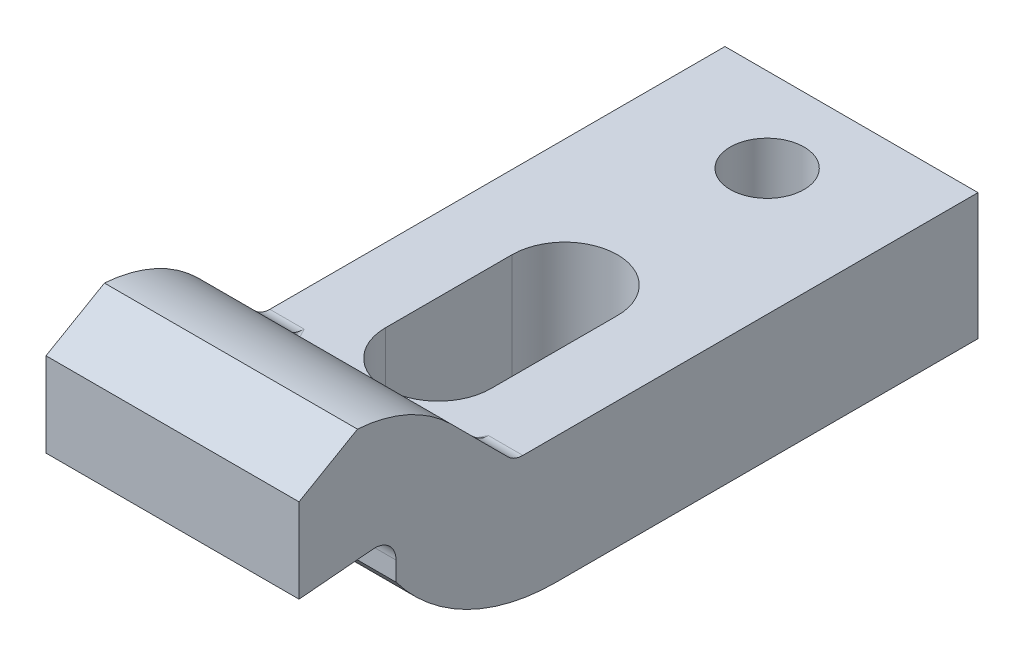
ISO-10303-21;
HEADER;
FILE_DESCRIPTION(('STEP AP214'),'2;1');
FILE_NAME('part.step','',(''),(''),'','','');
FILE_SCHEMA(('AUTOMOTIVE_DESIGN { 1 0 10303 214 1 1 1 1 }'));
ENDSEC;
DATA;
#1=APPLICATION_CONTEXT('core data for automotive mechanical design processes');
#2=APPLICATION_PROTOCOL_DEFINITION('international standard','automotive_design',2000,#1);
#3=PRODUCT_CONTEXT('',#1,'mechanical');
#4=PRODUCT('Part','Part','',(#3));
#5=PRODUCT_RELATED_PRODUCT_CATEGORY('part','',(#4));
#6=PRODUCT_DEFINITION_FORMATION('','',#4);
#7=PRODUCT_DEFINITION_CONTEXT('part definition',#1,'design');
#8=PRODUCT_DEFINITION('design','',#6,#7);
#9=PRODUCT_DEFINITION_SHAPE('','',#8);
#10=(LENGTH_UNIT() NAMED_UNIT(*) SI_UNIT(.MILLI.,.METRE.));
#11=(NAMED_UNIT(*) PLANE_ANGLE_UNIT() SI_UNIT($,.RADIAN.));
#12=(NAMED_UNIT(*) SI_UNIT($,.STERADIAN.) SOLID_ANGLE_UNIT());
#13=UNCERTAINTY_MEASURE_WITH_UNIT(LENGTH_MEASURE(1.E-05),#10,'distance_accuracy_value','');
#14=(GEOMETRIC_REPRESENTATION_CONTEXT(3) GLOBAL_UNCERTAINTY_ASSIGNED_CONTEXT((#13)) GLOBAL_UNIT_ASSIGNED_CONTEXT((#10,
#11,#12)) REPRESENTATION_CONTEXT('',''));
#15=CARTESIAN_POINT('',(0.,0.,0.));
#16=DIRECTION('',(0.,0.,1.));
#17=DIRECTION('',(1.,0.,0.));
#18=AXIS2_PLACEMENT_3D('',#15,#16,#17);
#19=CARTESIAN_POINT('',(30.,8.00000000000001,-53.0710678118655));
#20=DIRECTION('',(-1.,0.,0.));
#21=DIRECTION('',(0.,0.,1.));
#22=AXIS2_PLACEMENT_3D('',#19,#20,#21);
#23=CYLINDRICAL_SURFACE('',#22,5.);
#24=DIRECTION('',(-1.,0.,0.));
#25=VECTOR('',#24,1.);
#26=CARTESIAN_POINT('',(30.,3.00000000000002,-53.0710678118655));
#27=LINE('',#26,#25);
#28=CARTESIAN_POINT('',(30.,3.00000000000002,-53.0710678118655));
#29=VERTEX_POINT('',#28);
#30=CARTESIAN_POINT('',(21.8498582513349,3.00000000000002,-53.0710678118655));
#31=VERTEX_POINT('',#30);
#32=EDGE_CURVE('E287',#29,#31,#27,.T.);
#33=ORIENTED_EDGE('',*,*,#32,.T.);
#34=CARTESIAN_POINT('',(21.3972594617803,4.00000000000002,-50.0710678118703));
#35=CARTESIAN_POINT('',(21.4342316478842,3.95409560237578,-50.1322448278663));
#36=CARTESIAN_POINT('',(21.4684224776329,3.90883737505576,-50.1955419260955));
#37=CARTESIAN_POINT('',(21.5315798369727,3.82026238263095,-50.3258989662313));
#38=CARTESIAN_POINT('',(21.5605507551518,3.77694400985928,-50.3929556844871));
#39=CARTESIAN_POINT('',(21.6135329640899,3.6930319862811,-50.5301100447777));
#40=CARTESIAN_POINT('',(21.6375687103294,3.65242560775871,-50.6001905018779));
#41=CARTESIAN_POINT('',(21.6812572441394,3.5741501665851,-50.7432966284774));
#42=CARTESIAN_POINT('',(21.700908968448,3.53648181793508,-50.8163230073943));
#43=CARTESIAN_POINT('',(21.7579747506823,3.42012481943116,-51.0564734419794));
#44=CARTESIAN_POINT('',(21.7874766934176,3.34801810134903,-51.2287757528117));
#45=CARTESIAN_POINT('',(21.8310072247658,3.22309857913036,-51.5822699821501));
#46=CARTESIAN_POINT('',(21.8450063573796,3.17032263111566,-51.7634781425447));
#47=CARTESIAN_POINT('',(21.8615018891417,3.08603104688066,-52.1289105700668));
#48=CARTESIAN_POINT('',(21.8641341992811,3.05426807633162,-52.3130726197917));
#49=CARTESIAN_POINT('',(21.8619564602145,3.01156564474036,-52.6834887133141));
#50=CARTESIAN_POINT('',(21.8571582808752,3.0005930342811,-52.8697389497055));
#51=CARTESIAN_POINT('',(21.850232104344,3.00000778165171,-53.0608714315511));
#52=CARTESIAN_POINT('',(21.8500458894273,2.99999998362332,-53.0659697173758));
#53=CARTESIAN_POINT('',(21.8498582513349,3.00000000000002,-53.0710678118655));
#54=B_SPLINE_CURVE_WITH_KNOTS('',3,(#34,#35,#36,#37,#38,#39,#40,#41,#42,#43,#44,#45,#46,#47,#48,
#49,#50,#51,#52,#53),.UNSPECIFIED.,.F.,.F.,(4,2,2,2,2,2,2,2,2,4),(0.,0.254733137582074,
0.509251101222605,0.762475665793937,1.01576157859401,1.58082666070682,2.14696355817195,
2.70631218356487,3.26476819644138,3.28007324038832),.UNSPECIFIED.);
#55=CARTESIAN_POINT('',(21.3972594617795,3.99999999999732,-50.0710678118691));
#56=VERTEX_POINT('',#55);
#57=EDGE_CURVE('E52',#31,#56,#54,.F.);
#58=ORIENTED_EDGE('',*,*,#57,.T.);
#59=CARTESIAN_POINT('',(22.9437639807296,3.00000000000002,-53.0710678118655));
#60=CARTESIAN_POINT('',(22.8760573986062,2.99999426448376,-52.9145689338522));
#61=CARTESIAN_POINT('',(22.8067333862166,3.0073464548629,-52.7588088275273));
#62=CARTESIAN_POINT('',(22.6654710671842,3.03631501081593,-52.4498799510629));
#63=CARTESIAN_POINT('',(22.5935336574785,3.05792652538183,-52.2967103178161));
#64=CARTESIAN_POINT('',(22.4474527726027,3.1150273428862,-51.9936249718379));
#65=CARTESIAN_POINT('',(22.3733046637416,3.15054801217975,-51.8437174276487));
#66=CARTESIAN_POINT('',(22.2236200688811,3.23500196275884,-51.5484453384995));
#67=CARTESIAN_POINT('',(22.1480835181364,3.28393587101378,-51.403081006255));
#68=CARTESIAN_POINT('',(21.9964047622606,3.39473016828161,-51.1179037984177));
#69=CARTESIAN_POINT('',(21.9202633303616,3.45657601579426,-50.9780848865528));
#70=CARTESIAN_POINT('',(21.7680912458895,3.59277829096489,-50.7046851221836));
#71=CARTESIAN_POINT('',(21.6920606132031,3.66713673838296,-50.5711052812327));
#72=CARTESIAN_POINT('',(21.4657288929138,3.9080963225731,-50.1815774883752));
#73=CARTESIAN_POINT('',(21.3165723168119,4.09302744057365,-49.935694825611));
#74=CARTESIAN_POINT('',(21.154992659211,4.32702515365911,-49.6783068557061));
#75=CARTESIAN_POINT('',(21.1367189181197,4.3540003893984,-49.6493340722286));
#76=CARTESIAN_POINT('',(21.1003882046591,4.40868046202804,-49.5919891682992));
#77=CARTESIAN_POINT('',(21.0823311014671,4.4363848226013,-49.5636166765272));
#78=CARTESIAN_POINT('',(21.0643811397751,4.46446609406726,-49.5355339059327));
#79=B_SPLINE_CURVE_WITH_KNOTS('',3,(#59,#60,#61,#62,#63,#64,#65,#66,#67,#68,#69,#70,#71,#72,#73,
#74,#75,#76,#77,#78),.UNSPECIFIED.,.F.,.F.,(4,2,2,2,2,2,2,2,2,4),(0.,0.511331939016951,
1.02249001304428,1.53480749362325,2.04714892532764,2.55891643798159,3.07076663855698,
4.09038423126011,4.22118728509444,4.35190691201045),.UNSPECIFIED.);
#80=CARTESIAN_POINT('',(21.0643811397751,4.46446609406726,-49.5355339059327));
#81=VERTEX_POINT('',#80);
#82=EDGE_CURVE('E370',#56,#81,#79,.T.);
#83=ORIENTED_EDGE('',*,*,#82,.T.);
#84=DIRECTION('',(-1.,0.,0.));
#85=VECTOR('',#84,1.);
#86=CARTESIAN_POINT('',(30.,4.46446609406726,-49.5355339059327));
#87=LINE('',#86,#85);
#88=CARTESIAN_POINT('',(30.,4.46446609406726,-49.5355339059327));
#89=VERTEX_POINT('',#88);
#90=EDGE_CURVE('E290',#89,#81,#87,.T.);
#91=ORIENTED_EDGE('',*,*,#90,.F.);
#92=CARTESIAN_POINT('',(30.,8.00000000000001,-53.0710678118655));
#93=DIRECTION('',(-1.,0.,0.));
#94=DIRECTION('',(0.,0.,-1.));
#95=AXIS2_PLACEMENT_3D('',#92,#93,#94);
#96=CIRCLE('',#95,5.);
#97=EDGE_CURVE('E344',#29,#89,#96,.T.);
#98=ORIENTED_EDGE('',*,*,#97,.F.);
#99=EDGE_LOOP('',(#33,#58,#83,#91,#98));
#100=FACE_BOUND('',#99,.T.);
#101=ADVANCED_FACE('F39',(#100),#23,.F.);
#102=CARTESIAN_POINT('',(-21.0643811397751,4.46446609406726,-49.5355339059327));
#103=CARTESIAN_POINT('',(-21.1365594991918,4.35158201803706,-49.6484315748783));
#104=CARTESIAN_POINT('',(-21.2105001648796,4.24468588532388,-49.7661274082118));
#105=CARTESIAN_POINT('',(-21.3607999158626,4.04326775283876,-50.010135070182));
#106=CARTESIAN_POINT('',(-21.4371578578489,3.94874000860857,-50.1364428572643));
#107=CARTESIAN_POINT('',(-21.5890366779367,3.77489052527368,-50.3930526282165));
#108=CARTESIAN_POINT('',(-21.6645183489796,3.6952093126856,-50.5231348772543));
#109=CARTESIAN_POINT('',(-21.8159473707516,3.54812307149557,-50.789842199874));
#110=CARTESIAN_POINT('',(-21.8918948090007,3.48072042800963,-50.9264685381514));
#111=CARTESIAN_POINT('',(-22.0510581594278,3.35246482970086,-51.2194514281881));
#112=CARTESIAN_POINT('',(-22.1342395645024,3.29294561751501,-51.3764129315896));
#113=CARTESIAN_POINT('',(-22.2992295175767,3.18981757333803,-51.6961618896255));
#114=CARTESIAN_POINT('',(-22.3810381414085,3.1462078597327,-51.8589490208874));
#115=CARTESIAN_POINT('',(-22.5450319920476,3.07433977119804,-52.1945649062154));
#116=CARTESIAN_POINT('',(-22.627142675541,3.04662774731025,-52.367548027561));
#117=CARTESIAN_POINT('',(-22.7881209631609,3.00944823138909,-52.7170550351405));
#118=CARTESIAN_POINT('',(-22.8669867924221,2.99999059761315,-52.8935807826021));
#119=CARTESIAN_POINT('',(-22.9437639807296,3.00000000000002,-53.0710678118655));
#120=B_SPLINE_CURVE_WITH_KNOTS('',3,(#102,#103,#104,#105,#106,#107,#108,#109,#110,#111,#112,
#113,#114,#115,#116,#117,#118,#119),.UNSPECIFIED.,.F.,.F.,(4,2,2,2,2,2,2,2,4),(0.,
0.525396077973987,1.05054726464196,1.56057702218301,2.07070574777006,2.6319681545894,
3.1931994547025,3.77271303660372,4.35253949651918),.UNSPECIFIED.);
#121=CARTESIAN_POINT('',(-21.0643811397751,4.46446609406726,-49.5355339059327));
#122=VERTEX_POINT('',#121);
#123=CARTESIAN_POINT('',(-21.3972594617773,4.00000000000002,-50.0710678118655));
#124=VERTEX_POINT('',#123);
#125=EDGE_CURVE('E362',#122,#124,#120,.T.);
#126=ORIENTED_EDGE('',*,*,#125,.T.);
#127=CARTESIAN_POINT('',(-21.3972594617773,4.00000000000002,-50.0710678118655));
#128=CARTESIAN_POINT('',(-21.4342316478819,3.95409560237743,-50.1322448278623));
#129=CARTESIAN_POINT('',(-21.4684224776309,3.90883737505807,-50.1955419260917));
#130=CARTESIAN_POINT('',(-21.5315798369711,3.82026238263371,-50.3258989662276));
#131=CARTESIAN_POINT('',(-21.5605507551501,3.77694400986183,-50.3929556844832));
#132=CARTESIAN_POINT('',(-21.6135329640884,3.69303198628342,-50.5301100447736));
#133=CARTESIAN_POINT('',(-21.6375687103281,3.65242560776103,-50.6001905018738));
#134=CARTESIAN_POINT('',(-21.6812572441381,3.57415016658734,-50.7432966284731));
#135=CARTESIAN_POINT('',(-21.7009089684469,3.53648181793726,-50.8163230073901));
#136=CARTESIAN_POINT('',(-21.7579747506815,3.42012481943277,-51.0564734419757));
#137=CARTESIAN_POINT('',(-21.7874766934172,3.34801810135022,-51.2287757528086));
#138=CARTESIAN_POINT('',(-21.8310072247657,3.22309857913087,-51.5822699821484));
#139=CARTESIAN_POINT('',(-21.8450063573795,3.1703226311159,-51.7634781425437));
#140=CARTESIAN_POINT('',(-21.8615018891417,3.0860310468807,-52.1289105700666));
#141=CARTESIAN_POINT('',(-21.8641341992811,3.05426807633165,-52.3130726197915));
#142=CARTESIAN_POINT('',(-21.8619564602145,3.01156564474037,-52.6834887133141));
#143=CARTESIAN_POINT('',(-21.8571582808751,3.0005930342811,-52.8697389497055));
#144=CARTESIAN_POINT('',(-21.8502321043439,3.00000778165171,-53.0608714315511));
#145=CARTESIAN_POINT('',(-21.8500458894272,2.99999998362332,-53.0659697173758));
#146=CARTESIAN_POINT('',(-21.8498582513349,3.00000000000002,-53.0710678118655));
#147=B_SPLINE_CURVE_WITH_KNOTS('',3,(#127,#128,#129,#130,#131,#132,#133,#134,#135,#136,#137,
#138,#139,#140,#141,#142,#143,#144,#145,#146),.UNSPECIFIED.,.F.,.F.,(4,2,2,2,2,2,2,2,2,4),(0.,
0.254733137581992,0.509251101222479,0.762475665793813,1.01576157859387,1.58082666070905,
2.14696355817649,2.7063121835695,3.26476819644616,3.2800732403931),.UNSPECIFIED.);
#148=CARTESIAN_POINT('',(-21.8498582513349,3.00000000000002,-53.0710678118655));
#149=VERTEX_POINT('',#148);
#150=EDGE_CURVE('E11',#124,#149,#147,.T.);
#151=ORIENTED_EDGE('',*,*,#150,.T.);
#152=CARTESIAN_POINT('',(-30.,3.00000000000002,-53.0710678118655));
#153=VERTEX_POINT('',#152);
#154=EDGE_CURVE('E289',#149,#153,#27,.T.);
#155=ORIENTED_EDGE('',*,*,#154,.T.);
#156=CARTESIAN_POINT('',(-30.,8.00000000000001,-53.0710678118655));
#157=DIRECTION('',(-1.,0.,0.));
#158=DIRECTION('',(0.,0.,-1.));
#159=AXIS2_PLACEMENT_3D('',#156,#157,#158);
#160=CIRCLE('',#159,5.);
#161=CARTESIAN_POINT('',(-30.,4.46446609406726,-49.5355339059327));
#162=VERTEX_POINT('',#161);
#163=EDGE_CURVE('E316',#153,#162,#160,.T.);
#164=ORIENTED_EDGE('',*,*,#163,.T.);
#165=EDGE_CURVE('E293',#122,#162,#87,.T.);
#166=ORIENTED_EDGE('',*,*,#165,.F.);
#167=EDGE_LOOP('',(#126,#151,#155,#164,#166));
#168=FACE_BOUND('',#167,.T.);
#169=ADVANCED_FACE('F246',(#168),#23,.F.);
#170=CARTESIAN_POINT('',(30.,1.52755234071093,-17.5668519181758));
#171=DIRECTION('',(0.,0.996240588195683,0.086629616364842));
#172=DIRECTION('',(0.,-0.086629616364842,0.996240588195683));
#173=AXIS2_PLACEMENT_3D('',#170,#171,#172);
#174=PLANE('',#173);
#175=DIRECTION('',(0.,0.086629616364842,-0.996240588195683));
#176=VECTOR('',#175,1.);
#177=CARTESIAN_POINT('',(-30.,1.52755234071093,-17.5668519181758));
#178=LINE('',#177,#176);
#179=CARTESIAN_POINT('',(-30.,0.,0.));
#180=VERTEX_POINT('',#179);
#181=CARTESIAN_POINT('',(-30.,1.52755234071093,-17.5668519181758));
#182=VERTEX_POINT('',#181);
#183=EDGE_CURVE('E333',#180,#182,#178,.T.);
#184=ORIENTED_EDGE('',*,*,#183,.T.);
#185=DIRECTION('',(-1.,0.,0.));
#186=VECTOR('',#185,1.);
#187=CARTESIAN_POINT('',(30.,1.52755234071093,-17.5668519181758));
#188=LINE('',#187,#186);
#189=CARTESIAN_POINT('',(30.,1.52755234071093,-17.5668519181758));
#190=VERTEX_POINT('',#189);
#191=EDGE_CURVE('E270',#190,#182,#188,.T.);
#192=ORIENTED_EDGE('',*,*,#191,.F.);
#193=DIRECTION('',(0.,0.086629616364842,-0.996240588195683));
#194=VECTOR('',#193,1.);
#195=CARTESIAN_POINT('',(30.,1.52755234071093,-17.5668519181758));
#196=LINE('',#195,#194);
#197=CARTESIAN_POINT('',(30.,0.,0.));
#198=VERTEX_POINT('',#197);
#199=EDGE_CURVE('E309',#198,#190,#196,.T.);
#200=ORIENTED_EDGE('',*,*,#199,.F.);
#201=DIRECTION('',(-1.,0.,0.));
#202=VECTOR('',#201,1.);
#203=CARTESIAN_POINT('',(30.,0.,0.));
#204=LINE('',#203,#202);
#205=EDGE_CURVE('E303',#198,#180,#204,.T.);
#206=ORIENTED_EDGE('',*,*,#205,.T.);
#207=EDGE_LOOP('',(#184,#192,#200,#206));
#208=FACE_BOUND('',#207,.T.);
#209=ADVANCED_FACE('F251',(#208),#174,.F.);
#210=CARTESIAN_POINT('',(30.,-3.45365060026748,-18.));
#211=DIRECTION('',(-1.,0.,0.));
#212=DIRECTION('',(0.,0.,1.));
#213=AXIS2_PLACEMENT_3D('',#210,#211,#212);
#214=CYLINDRICAL_SURFACE('',#213,5.);
#215=CARTESIAN_POINT('',(-30.,-3.45365060026748,-18.));
#216=DIRECTION('',(-1.,0.,0.));
#217=DIRECTION('',(0.,0.,-1.));
#218=AXIS2_PLACEMENT_3D('',#215,#216,#217);
#219=CIRCLE('',#218,5.);
#220=CARTESIAN_POINT('',(-30.,-3.45365060026752,-23.));
#221=VERTEX_POINT('',#220);
#222=EDGE_CURVE('E331',#182,#221,#219,.T.);
#223=ORIENTED_EDGE('',*,*,#222,.T.);
#224=DIRECTION('',(-1.,0.,0.));
#225=VECTOR('',#224,1.);
#226=CARTESIAN_POINT('',(30.,-3.45365060026752,-23.));
#227=LINE('',#226,#225);
#228=CARTESIAN_POINT('',(30.,-3.45365060026752,-23.));
#229=VERTEX_POINT('',#228);
#230=EDGE_CURVE('E273',#229,#221,#227,.T.);
#231=ORIENTED_EDGE('',*,*,#230,.F.);
#232=CARTESIAN_POINT('',(30.,-3.45365060026748,-18.));
#233=DIRECTION('',(-1.,0.,0.));
#234=DIRECTION('',(0.,0.,-1.));
#235=AXIS2_PLACEMENT_3D('',#232,#233,#234);
#236=CIRCLE('',#235,5.);
#237=EDGE_CURVE('E356',#190,#229,#236,.T.);
#238=ORIENTED_EDGE('',*,*,#237,.F.);
#239=ORIENTED_EDGE('',*,*,#191,.T.);
#240=EDGE_LOOP('',(#223,#231,#238,#239));
#241=FACE_BOUND('',#240,.T.);
#242=ADVANCED_FACE('F438',(#241),#214,.F.);
#243=CARTESIAN_POINT('',(30.,-3.45365060026752,-23.));
#244=DIRECTION('',(0.,0.,-1.));
#245=DIRECTION('',(-1.,0.,0.));
#246=AXIS2_PLACEMENT_3D('',#243,#244,#245);
#247=PLANE('',#246);
#248=DIRECTION('',(0.,-1.,0.));
#249=VECTOR('',#248,1.);
#250=CARTESIAN_POINT('',(-30.,-3.45365060026752,-23.));
#251=LINE('',#250,#249);
#252=CARTESIAN_POINT('',(-30.,-7.99999999999999,-23.));
#253=VERTEX_POINT('',#252);
#254=EDGE_CURVE('E329',#221,#253,#251,.T.);
#255=ORIENTED_EDGE('',*,*,#254,.T.);
#256=DIRECTION('',(-1.,0.,0.));
#257=VECTOR('',#256,1.);
#258=CARTESIAN_POINT('',(30.,-7.99999999999999,-23.));
#259=LINE('',#258,#257);
#260=CARTESIAN_POINT('',(30.,-7.99999999999999,-23.));
#261=VERTEX_POINT('',#260);
#262=EDGE_CURVE('E276',#261,#253,#259,.T.);
#263=ORIENTED_EDGE('',*,*,#262,.F.);
#264=DIRECTION('',(0.,-1.,0.));
#265=VECTOR('',#264,1.);
#266=CARTESIAN_POINT('',(30.,-3.45365060026752,-23.));
#267=LINE('',#266,#265);
#268=EDGE_CURVE('E354',#229,#261,#267,.T.);
#269=ORIENTED_EDGE('',*,*,#268,.F.);
#270=ORIENTED_EDGE('',*,*,#230,.T.);
#271=EDGE_LOOP('',(#255,#263,#269,#270));
#272=FACE_BOUND('',#271,.T.);
#273=ADVANCED_FACE('F443',(#272),#247,.F.);
#274=CARTESIAN_POINT('',(30.,20.5,-61.));
#275=DIRECTION('',(-1.,0.,0.));
#276=DIRECTION('',(0.,0.,1.));
#277=AXIS2_PLACEMENT_3D('',#274,#275,#276);
#278=CYLINDRICAL_SURFACE('',#277,47.5);
#279=DIRECTION('',(-1.,0.,0.));
#280=VECTOR('',#279,1.);
#281=CARTESIAN_POINT('',(30.,-27.,-61.));
#282=LINE('',#281,#280);
#283=CARTESIAN_POINT('',(-12.3389626792531,-27.,-61.));
#284=VERTEX_POINT('',#283);
#285=CARTESIAN_POINT('',(-30.,-27.,-61.));
#286=VERTEX_POINT('',#285);
#287=EDGE_CURVE('E280',#284,#286,#282,.T.);
#288=ORIENTED_EDGE('',*,*,#287,.F.);
#289=CARTESIAN_POINT('',(12.3389626792531,-27.,-61.));
#290=CARTESIAN_POINT('',(12.2834785441314,-27.0000339448651,-60.6574217789326));
#291=CARTESIAN_POINT('',(12.2136478143961,-26.9962949481423,-60.3171888249822));
#292=CARTESIAN_POINT('',(12.0460213521242,-26.9818227435708,-59.6438996799632));
#293=CARTESIAN_POINT('',(11.9482308816135,-26.9710908513002,-59.3108421511502));
#294=CARTESIAN_POINT('',(11.7255934055885,-26.9432093842651,-58.6548536653471));
#295=CARTESIAN_POINT('',(11.600795697524,-26.9260714617835,-58.3319054688458));
#296=CARTESIAN_POINT('',(11.3250051872863,-26.886137961976,-57.6977558313218));
#297=CARTESIAN_POINT('',(11.174011819995,-26.8633422625904,-57.3865546438933));
#298=CARTESIAN_POINT('',(10.8469868049079,-26.812986445192,-56.7780907115094));
#299=CARTESIAN_POINT('',(10.6709602604541,-26.7854272980245,-56.4808251419786));
#300=CARTESIAN_POINT('',(10.2951104780828,-26.7265426921706,-55.9021312072585));
#301=CARTESIAN_POINT('',(10.0952867799752,-26.6952171606497,-55.6207031484906));
#302=CARTESIAN_POINT('',(9.67318897347936,-26.6298766044657,-55.075461829171));
#303=CARTESIAN_POINT('',(9.45091017829998,-26.5958610186619,-54.8116522650879));
#304=CARTESIAN_POINT('',(8.9854320513272,-26.5262843843958,-54.3034051767584));
#305=CARTESIAN_POINT('',(8.7422324888903,-26.4907233188973,-54.0589678661409));
#306=CARTESIAN_POINT('',(8.23191969618433,-26.4185720559416,-53.5867902129602));
#307=CARTESIAN_POINT('',(7.96445280363948,-26.3819748899348,-53.3594330108222));
#308=CARTESIAN_POINT('',(7.4112772750017,-26.3096146021876,-52.9279587257128));
#309=CARTESIAN_POINT('',(7.1255683997126,-26.2738514913921,-52.7238419475769));
#310=CARTESIAN_POINT('',(6.53779331780197,-26.2043533227536,-52.3402428209424));
#311=CARTESIAN_POINT('',(6.2357257288639,-26.170618436806,-52.1607625587809));
#312=CARTESIAN_POINT('',(5.61729076096066,-26.1063132016944,-51.8277404432416));
#313=CARTESIAN_POINT('',(5.30092344036188,-26.0757428396155,-51.674198484005));
#314=CARTESIAN_POINT('',(4.65478433833723,-26.0186897671465,-51.3936432114443));
#315=CARTESIAN_POINT('',(4.32496473175113,-25.9922236060269,-51.266736608162));
#316=CARTESIAN_POINT('',(3.65542276341636,-25.9444377033948,-51.0412095461504));
#317=CARTESIAN_POINT('',(3.31570035519443,-25.9231179860386,-50.9425892201905));
#318=CARTESIAN_POINT('',(2.62887659983935,-25.8863731872897,-50.774453694017));
#319=CARTESIAN_POINT('',(2.28177659960278,-25.8709470395258,-50.7049332283131));
#320=CARTESIAN_POINT('',(1.58271171015708,-25.8465288725995,-50.5955580700144));
#321=CARTESIAN_POINT('',(1.23074692095216,-25.837536721375,-50.5557027685214));
#322=CARTESIAN_POINT('',(0.532310269731596,-25.8264280225382,-50.5065409414182));
#323=CARTESIAN_POINT('',(0.18588617475608,-25.8241656990546,-50.4965866772545));
#324=CARTESIAN_POINT('',(-0.506570457201823,-25.8261790579468,-50.5054701755363));
#325=CARTESIAN_POINT('',(-0.852602999817575,-25.8304546450316,-50.5243075183402));
#326=CARTESIAN_POINT('',(-1.5417638200386,-25.8453976600284,-50.5906164815365));
#327=CARTESIAN_POINT('',(-1.88489216076334,-25.8560649486605,-50.6380874779808));
#328=CARTESIAN_POINT('',(-2.5657940250787,-25.8834288602403,-50.7612744718555));
#329=CARTESIAN_POINT('',(-2.90356754146506,-25.9001254912991,-50.836990507283));
#330=CARTESIAN_POINT('',(-3.56871359878634,-25.938830303612,-51.0153474035617));
#331=CARTESIAN_POINT('',(-3.89614761525321,-25.9607950518099,-51.1177686652039));
#332=CARTESIAN_POINT('',(-4.54118431124583,-26.009383810852,-51.3490328704551));
#333=CARTESIAN_POINT('',(-4.85878706287303,-26.0360077875163,-51.4778756202389));
#334=CARTESIAN_POINT('',(-5.4820188225299,-26.093048242181,-51.76102305223));
#335=CARTESIAN_POINT('',(-5.78764951866318,-26.1234641829524,-51.9153241286123));
#336=CARTESIAN_POINT('',(-6.38514117981854,-26.1871305055767,-52.2483949005221));
#337=CARTESIAN_POINT('',(-6.67699585140963,-26.2203821637958,-52.4271756365886));
#338=CARTESIAN_POINT('',(-7.25058618280942,-26.2893294245501,-52.8117428670773));
#339=CARTESIAN_POINT('',(-7.53200471794253,-26.3250605028115,-53.0179961408852));
#340=CARTESIAN_POINT('',(-8.07646140439583,-26.3971619118741,-53.4531589028638));
#341=CARTESIAN_POINT('',(-8.33950698405465,-26.4335319767965,-53.6820591431591));
#342=CARTESIAN_POINT('',(-8.84574033038398,-26.5057391514329,-54.1611990022158));
#343=CARTESIAN_POINT('',(-9.08891734134327,-26.5415759640015,-54.4114500311941));
#344=CARTESIAN_POINT('',(-9.55361022546067,-26.6114906786403,-54.9315344521837));
#345=CARTESIAN_POINT('',(-9.77512656360313,-26.6455686184603,-55.2013674236175));
#346=CARTESIAN_POINT('',(-10.197817769053,-26.7112358832772,-55.7626252308121));
#347=CARTESIAN_POINT('',(-10.3986764064653,-26.7427852395541,-56.0542930574724));
#348=CARTESIAN_POINT('',(-10.77508830273,-26.8017155733802,-56.6539166929035));
#349=CARTESIAN_POINT('',(-10.9506424044955,-26.8290966897783,-56.96187195866));
#350=CARTESIAN_POINT('',(-11.2749274800748,-26.8786038641256,-57.5915546033435));
#351=CARTESIAN_POINT('',(-11.4236888996441,-26.9007358960324,-57.9132658295015));
#352=CARTESIAN_POINT('',(-11.693410162898,-26.9388517339159,-58.5683450754977));
#353=CARTESIAN_POINT('',(-11.8143823146416,-26.9548382638989,-58.9017078591105));
#354=CARTESIAN_POINT('',(-12.0118238321071,-26.9780487490486,-59.5276474481004));
#355=CARTESIAN_POINT('',(-12.0922305075665,-26.9862197078094,-59.8189541228989));
#356=CARTESIAN_POINT('',(-12.2316621320549,-26.9972004498571,-60.4062517998946));
#357=CARTESIAN_POINT('',(-12.2907206429922,-27.0000186782283,-60.7022346790725));
#358=CARTESIAN_POINT('',(-12.3389626792531,-27.,-61.));
#359=B_SPLINE_CURVE_WITH_KNOTS('',3,(#289,#290,#291,#292,#293,#294,#295,#296,#297,#298,#299,
#300,#301,#302,#303,#304,#305,#306,#307,#308,#309,#310,#311,#312,#313,#314,#315,#316,#317,#318,
#319,#320,#321,#322,#323,#324,#325,#326,#327,#328,#329,#330,#331,#332,#333,#334,#335,#336,#337,
#338,#339,#340,#341,#342,#343,#344,#345,#346,#347,#348,#349,#350,#351,#352,#353,#354,#355,#356,
#357,#358),.UNSPECIFIED.,.F.,.F.,(4,2,2,2,2,2,2,2,2,2,2,2,2,2,2,2,2,2,2,2,2,2,2,2,2,2,2,2,2,2,2,
2,2,2,4),(0.,1.04077478647485,2.08135382781598,3.12004924076176,4.15876706423273,
5.19727343417835,6.23579989005602,7.27454355508175,8.31329867332876,9.37088961636005,
10.4284944297963,11.4861887510452,12.5438787555537,13.6057285715423,14.6675833715317,
15.7292459504669,16.7908867374393,17.8293573682589,18.867812863375,19.9062457306094,
20.9446799948106,21.9748305997163,23.0049736478163,24.0349709152447,25.0654342599472,
26.1164123094886,27.1669629503125,28.2180785824354,29.2691716455608,30.334504307046,
31.3998014732939,32.4638803487803,33.5274870237724,34.433597692192,35.3382775846115),.UNSPECIFIED.);
#360=CARTESIAN_POINT('',(12.3389626792531,-27.,-61.));
#361=VERTEX_POINT('',#360);
#362=EDGE_CURVE('E195',#361,#284,#359,.T.);
#363=ORIENTED_EDGE('',*,*,#362,.F.);
#364=CARTESIAN_POINT('',(30.,-27.,-61.));
#365=VERTEX_POINT('',#364);
#366=EDGE_CURVE('E203',#365,#361,#282,.T.);
#367=ORIENTED_EDGE('',*,*,#366,.F.);
#368=CARTESIAN_POINT('',(30.,20.5,-61.));
#369=DIRECTION('',(1.,0.,0.));
#370=DIRECTION('',(0.,0.,-1.));
#371=AXIS2_PLACEMENT_3D('',#368,#369,#370);
#372=CIRCLE('',#371,47.5);
#373=EDGE_CURVE('E352',#261,#365,#372,.T.);
#374=ORIENTED_EDGE('',*,*,#373,.F.);
#375=ORIENTED_EDGE('',*,*,#262,.T.);
#376=CARTESIAN_POINT('',(-30.,20.5,-61.));
#377=DIRECTION('',(1.,0.,0.));
#378=DIRECTION('',(0.,0.,-1.));
#379=AXIS2_PLACEMENT_3D('',#376,#377,#378);
#380=CIRCLE('',#379,47.5);
#381=EDGE_CURVE('E326',#253,#286,#380,.T.);
#382=ORIENTED_EDGE('',*,*,#381,.T.);
#383=EDGE_LOOP('',(#288,#363,#367,#374,#375,#382));
#384=FACE_BOUND('',#383,.T.);
#385=ADVANCED_FACE('F448',(#384),#278,.T.);
#386=CARTESIAN_POINT('',(30.,-27.,-161.));
#387=DIRECTION('',(0.,1.,0.));
#388=DIRECTION('',(0.,0.,1.));
#389=AXIS2_PLACEMENT_3D('',#386,#387,#388);
#390=PLANE('',#389);
#391=ORIENTED_EDGE('',*,*,#366,.T.);
#392=CARTESIAN_POINT('',(0.,-27.,-63.));
#393=DIRECTION('',(0.,1.,0.));
#394=DIRECTION('',(0.,0.,1.));
#395=AXIS2_PLACEMENT_3D('',#392,#393,#394);
#396=CIRCLE('',#395,12.5);
#397=CARTESIAN_POINT('',(12.5,-27.,-63.));
#398=VERTEX_POINT('',#397);
#399=EDGE_CURVE('E183',#398,#361,#396,.F.);
#400=ORIENTED_EDGE('',*,*,#399,.F.);
#401=DIRECTION('',(0.,0.,1.));
#402=VECTOR('',#401,1.);
#403=CARTESIAN_POINT('',(12.5,-27.,-63.));
#404=LINE('',#403,#402);
#405=CARTESIAN_POINT('',(12.5,-27.,-93.));
#406=VERTEX_POINT('',#405);
#407=EDGE_CURVE('E192',#406,#398,#404,.T.);
#408=ORIENTED_EDGE('',*,*,#407,.F.);
#409=CARTESIAN_POINT('',(0.,-27.,-93.));
#410=DIRECTION('',(0.,1.,0.));
#411=DIRECTION('',(0.,0.,1.));
#412=AXIS2_PLACEMENT_3D('',#409,#410,#411);
#413=CIRCLE('',#412,12.5);
#414=CARTESIAN_POINT('',(-12.5,-27.,-93.));
#415=VERTEX_POINT('',#414);
#416=EDGE_CURVE('E59',#415,#406,#413,.F.);
#417=ORIENTED_EDGE('',*,*,#416,.F.);
#418=DIRECTION('',(0.,0.,-1.));
#419=VECTOR('',#418,1.);
#420=CARTESIAN_POINT('',(-12.5,-27.,-63.));
#421=LINE('',#420,#419);
#422=CARTESIAN_POINT('',(-12.5,-27.,-63.));
#423=VERTEX_POINT('',#422);
#424=EDGE_CURVE('E205',#423,#415,#421,.T.);
#425=ORIENTED_EDGE('',*,*,#424,.F.);
#426=EDGE_CURVE('E204',#284,#423,#396,.F.);
#427=ORIENTED_EDGE('',*,*,#426,.F.);
#428=ORIENTED_EDGE('',*,*,#287,.T.);
#429=DIRECTION('',(0.,0.,-1.));
#430=VECTOR('',#429,1.);
#431=CARTESIAN_POINT('',(-30.,-27.,-161.));
#432=LINE('',#431,#430);
#433=CARTESIAN_POINT('',(-30.,-27.,-161.));
#434=VERTEX_POINT('',#433);
#435=EDGE_CURVE('E324',#286,#434,#432,.T.);
#436=ORIENTED_EDGE('',*,*,#435,.T.);
#437=DIRECTION('',(-1.,0.,0.));
#438=VECTOR('',#437,1.);
#439=CARTESIAN_POINT('',(30.,-27.,-161.));
#440=LINE('',#439,#438);
#441=CARTESIAN_POINT('',(30.,-27.,-161.));
#442=VERTEX_POINT('',#441);
#443=EDGE_CURVE('E281',#442,#434,#440,.T.);
#444=ORIENTED_EDGE('',*,*,#443,.F.);
#445=DIRECTION('',(0.,0.,-1.));
#446=VECTOR('',#445,1.);
#447=CARTESIAN_POINT('',(30.,-27.,-161.));
#448=LINE('',#447,#446);
#449=EDGE_CURVE('E350',#365,#442,#448,.T.);
#450=ORIENTED_EDGE('',*,*,#449,.F.);
#451=EDGE_LOOP('',(#391,#400,#408,#417,#425,#427,#428,#436,#444,#450));
#452=FACE_BOUND('',#451,.T.);
#453=CARTESIAN_POINT('',(0.,-27.,-141.));
#454=DIRECTION('',(0.,1.,0.));
#455=DIRECTION('',(0.,0.,1.));
#456=AXIS2_PLACEMENT_3D('',#453,#454,#455);
#457=CIRCLE('',#456,8.75);
#458=CARTESIAN_POINT('',(0.,-27.,-132.25));
#459=VERTEX_POINT('',#458);
#460=EDGE_CURVE('E390',#459,#459,#457,.T.);
#461=ORIENTED_EDGE('',*,*,#460,.T.);
#462=EDGE_LOOP('',(#461));
#463=FACE_BOUND('',#462,.T.);
#464=ADVANCED_FACE('F199',(#452,#463),#390,.F.);
#465=CARTESIAN_POINT('',(30.,3.00000000000001,-161.));
#466=DIRECTION('',(0.,0.,1.));
#467=DIRECTION('',(1.,0.,0.));
#468=AXIS2_PLACEMENT_3D('',#465,#466,#467);
#469=PLANE('',#468);
#470=DIRECTION('',(0.,1.,0.));
#471=VECTOR('',#470,1.);
#472=CARTESIAN_POINT('',(-30.,3.00000000000001,-161.));
#473=LINE('',#472,#471);
#474=CARTESIAN_POINT('',(-30.,3.00000000000001,-161.));
#475=VERTEX_POINT('',#474);
#476=EDGE_CURVE('E322',#434,#475,#473,.T.);
#477=ORIENTED_EDGE('',*,*,#476,.T.);
#478=DIRECTION('',(-1.,0.,0.));
#479=VECTOR('',#478,1.);
#480=CARTESIAN_POINT('',(30.,3.00000000000001,-161.));
#481=LINE('',#480,#479);
#482=CARTESIAN_POINT('',(30.,3.00000000000001,-161.));
#483=VERTEX_POINT('',#482);
#484=EDGE_CURVE('E284',#483,#475,#481,.T.);
#485=ORIENTED_EDGE('',*,*,#484,.F.);
#486=DIRECTION('',(0.,1.,0.));
#487=VECTOR('',#486,1.);
#488=CARTESIAN_POINT('',(30.,3.00000000000001,-161.));
#489=LINE('',#488,#487);
#490=EDGE_CURVE('E348',#442,#483,#489,.T.);
#491=ORIENTED_EDGE('',*,*,#490,.F.);
#492=ORIENTED_EDGE('',*,*,#443,.T.);
#493=EDGE_LOOP('',(#477,#485,#491,#492));
#494=FACE_BOUND('',#493,.T.);
#495=ADVANCED_FACE('F454',(#494),#469,.F.);
#496=CARTESIAN_POINT('',(30.,3.00000000000002,-53.0710678118655));
#497=DIRECTION('',(0.,-1.,0.));
#498=DIRECTION('',(0.,0.,-1.));
#499=AXIS2_PLACEMENT_3D('',#496,#497,#498);
#500=PLANE('',#499);
#501=DIRECTION('',(0.,0.,-1.));
#502=VECTOR('',#501,1.);
#503=CARTESIAN_POINT('',(12.5,3.00000000000002,-63.));
#504=LINE('',#503,#502);
#505=CARTESIAN_POINT('',(12.5,3.00000000000002,-63.));
#506=VERTEX_POINT('',#505);
#507=CARTESIAN_POINT('',(12.5,3.00000000000002,-93.));
#508=VERTEX_POINT('',#507);
#509=EDGE_CURVE('E212',#506,#508,#504,.T.);
#510=ORIENTED_EDGE('',*,*,#509,.F.);
#511=CARTESIAN_POINT('',(0.,3.00000000000002,-63.));
#512=DIRECTION('',(0.,1.,0.));
#513=DIRECTION('',(0.,0.,1.));
#514=AXIS2_PLACEMENT_3D('',#511,#512,#513);
#515=CIRCLE('',#514,12.5);
#516=CARTESIAN_POINT('',(-12.5,3.00000000000002,-63.));
#517=VERTEX_POINT('',#516);
#518=EDGE_CURVE('E67',#517,#506,#515,.T.);
#519=ORIENTED_EDGE('',*,*,#518,.F.);
#520=DIRECTION('',(0.,0.,1.));
#521=VECTOR('',#520,1.);
#522=CARTESIAN_POINT('',(-12.5,3.00000000000002,-63.));
#523=LINE('',#522,#521);
#524=CARTESIAN_POINT('',(-12.5,3.00000000000002,-93.));
#525=VERTEX_POINT('',#524);
#526=EDGE_CURVE('E189',#525,#517,#523,.T.);
#527=ORIENTED_EDGE('',*,*,#526,.F.);
#528=CARTESIAN_POINT('',(0.,3.00000000000002,-93.));
#529=DIRECTION('',(0.,1.,0.));
#530=DIRECTION('',(0.,0.,1.));
#531=AXIS2_PLACEMENT_3D('',#528,#529,#530);
#532=CIRCLE('',#531,12.5);
#533=EDGE_CURVE('E214',#508,#525,#532,.T.);
#534=ORIENTED_EDGE('',*,*,#533,.F.);
#535=EDGE_LOOP('',(#510,#519,#527,#534));
#536=FACE_BOUND('',#535,.T.);
#537=CARTESIAN_POINT('',(0.,3.00000000000001,-141.));
#538=DIRECTION('',(0.,1.,0.));
#539=DIRECTION('',(0.,0.,1.));
#540=AXIS2_PLACEMENT_3D('',#537,#538,#539);
#541=CIRCLE('',#540,8.75);
#542=CARTESIAN_POINT('',(0.,3.00000000000001,-132.25));
#543=VERTEX_POINT('',#542);
#544=EDGE_CURVE('E229',#543,#543,#541,.T.);
#545=ORIENTED_EDGE('',*,*,#544,.F.);
#546=EDGE_LOOP('',(#545));
#547=FACE_BOUND('',#546,.T.);
#548=CARTESIAN_POINT('',(0.,3.00000000000002,-63.));
#549=DIRECTION('',(0.,-1.,0.));
#550=DIRECTION('',(0.,0.,-1.));
#551=AXIS2_PLACEMENT_3D('',#548,#549,#550);
#552=CIRCLE('',#551,24.);
#553=EDGE_CURVE('E267',#149,#31,#552,.F.);
#554=ORIENTED_EDGE('',*,*,#553,.T.);
#555=ORIENTED_EDGE('',*,*,#32,.F.);
#556=DIRECTION('',(0.,0.,1.));
#557=VECTOR('',#556,1.);
#558=CARTESIAN_POINT('',(30.,3.00000000000002,-53.0710678118655));
#559=LINE('',#558,#557);
#560=EDGE_CURVE('E346',#483,#29,#559,.T.);
#561=ORIENTED_EDGE('',*,*,#560,.F.);
#562=ORIENTED_EDGE('',*,*,#484,.T.);
#563=DIRECTION('',(0.,0.,1.));
#564=VECTOR('',#563,1.);
#565=CARTESIAN_POINT('',(-30.,3.00000000000002,-53.0710678118655));
#566=LINE('',#565,#564);
#567=EDGE_CURVE('E319',#475,#153,#566,.T.);
#568=ORIENTED_EDGE('',*,*,#567,.T.);
#569=ORIENTED_EDGE('',*,*,#154,.F.);
#570=EDGE_LOOP('',(#554,#555,#561,#562,#568,#569));
#571=FACE_BOUND('',#570,.T.);
#572=ADVANCED_FACE('F258',(#536,#547,#571),#500,.F.);
#573=CARTESIAN_POINT('',(30.,4.46446609406726,-49.5355339059327));
#574=DIRECTION('',(0.,-0.707106781186552,0.707106781186543));
#575=DIRECTION('',(0.,-0.707106781186543,-0.707106781186552));
#576=AXIS2_PLACEMENT_3D('',#573,#574,#575);
#577=PLANE('',#576);
#578=CARTESIAN_POINT('',(0.,-8.99999999999984,-63.));
#579=DIRECTION('',(0.,-0.707106781186552,0.707106781186543));
#580=DIRECTION('',(0.,-0.707106781186543,-0.707106781186552));
#581=AXIS2_PLACEMENT_3D('',#578,#579,#580);
#582=ELLIPSE('',#581,35.3553390593272,25.);
#583=EDGE_CURVE('E336',#81,#122,#582,.T.);
#584=ORIENTED_EDGE('',*,*,#583,.T.);
#585=ORIENTED_EDGE('',*,*,#165,.T.);
#586=DIRECTION('',(0.,0.707106781186543,0.707106781186552));
#587=VECTOR('',#586,1.);
#588=CARTESIAN_POINT('',(-30.,4.46446609406726,-49.5355339059327));
#589=LINE('',#588,#587);
#590=CARTESIAN_POINT('',(-30.,17.8338199598731,-36.1661800401267));
#591=VERTEX_POINT('',#590);
#592=EDGE_CURVE('E314',#162,#591,#589,.T.);
#593=ORIENTED_EDGE('',*,*,#592,.T.);
#594=DIRECTION('',(-1.,0.,0.));
#595=VECTOR('',#594,1.);
#596=CARTESIAN_POINT('',(30.,17.8338199598731,-36.1661800401267));
#597=LINE('',#596,#595);
#598=CARTESIAN_POINT('',(30.,17.8338199598731,-36.1661800401267));
#599=VERTEX_POINT('',#598);
#600=EDGE_CURVE('E294',#599,#591,#597,.T.);
#601=ORIENTED_EDGE('',*,*,#600,.F.);
#602=DIRECTION('',(0.,0.707106781186543,0.707106781186552));
#603=VECTOR('',#602,1.);
#604=CARTESIAN_POINT('',(30.,4.46446609406726,-49.5355339059327));
#605=LINE('',#604,#603);
#606=EDGE_CURVE('E342',#89,#599,#605,.T.);
#607=ORIENTED_EDGE('',*,*,#606,.F.);
#608=ORIENTED_EDGE('',*,*,#90,.T.);
#609=EDGE_LOOP('',(#584,#585,#593,#601,#607,#608));
#610=FACE_BOUND('',#609,.T.);
#611=ADVANCED_FACE('F256',(#610),#577,.F.);
#612=CARTESIAN_POINT('',(30.,-6.9149173816562,-11.4174426985977));
#613=DIRECTION('',(-1.,0.,0.));
#614=DIRECTION('',(0.,0.,1.));
#615=AXIS2_PLACEMENT_3D('',#612,#613,#614);
#616=CYLINDRICAL_SURFACE('',#615,35.);
#617=CARTESIAN_POINT('',(-30.,-6.9149173816562,-11.4174426985977));
#618=DIRECTION('',(1.,0.,0.));
#619=DIRECTION('',(0.,0.,1.));
#620=AXIS2_PLACEMENT_3D('',#617,#618,#619);
#621=CIRCLE('',#620,35.);
#622=CARTESIAN_POINT('',(-30.,28.,-13.8564064605511));
#623=VERTEX_POINT('',#622);
#624=EDGE_CURVE('E312',#591,#623,#621,.T.);
#625=ORIENTED_EDGE('',*,*,#624,.T.);
#626=DIRECTION('',(-1.,0.,0.));
#627=VECTOR('',#626,1.);
#628=CARTESIAN_POINT('',(30.,28.,-13.8564064605511));
#629=LINE('',#628,#627);
#630=CARTESIAN_POINT('',(30.,28.,-13.8564064605511));
#631=VERTEX_POINT('',#630);
#632=EDGE_CURVE('E297',#631,#623,#629,.T.);
#633=ORIENTED_EDGE('',*,*,#632,.F.);
#634=CARTESIAN_POINT('',(30.,-6.9149173816562,-11.4174426985977));
#635=DIRECTION('',(1.,0.,0.));
#636=DIRECTION('',(0.,0.,1.));
#637=AXIS2_PLACEMENT_3D('',#634,#635,#636);
#638=CIRCLE('',#637,35.);
#639=EDGE_CURVE('E340',#599,#631,#638,.T.);
#640=ORIENTED_EDGE('',*,*,#639,.F.);
#641=ORIENTED_EDGE('',*,*,#600,.T.);
#642=EDGE_LOOP('',(#625,#633,#640,#641));
#643=FACE_BOUND('',#642,.T.);
#644=ADVANCED_FACE('F420',(#643),#616,.T.);
#645=CARTESIAN_POINT('',(30.,20.,0.));
#646=DIRECTION('',(0.,-0.86602540378444,-0.499999999999998));
#647=DIRECTION('',(0.,0.499999999999998,-0.86602540378444));
#648=AXIS2_PLACEMENT_3D('',#645,#646,#647);
#649=PLANE('',#648);
#650=DIRECTION('',(0.,-0.499999999999998,0.86602540378444));
#651=VECTOR('',#650,1.);
#652=CARTESIAN_POINT('',(-30.,20.,0.));
#653=LINE('',#652,#651);
#654=CARTESIAN_POINT('',(-30.,20.,0.));
#655=VERTEX_POINT('',#654);
#656=EDGE_CURVE('E310',#623,#655,#653,.T.);
#657=ORIENTED_EDGE('',*,*,#656,.T.);
#658=DIRECTION('',(-1.,0.,0.));
#659=VECTOR('',#658,1.);
#660=CARTESIAN_POINT('',(30.,20.,0.));
#661=LINE('',#660,#659);
#662=CARTESIAN_POINT('',(30.,20.,0.));
#663=VERTEX_POINT('',#662);
#664=EDGE_CURVE('E300',#663,#655,#661,.T.);
#665=ORIENTED_EDGE('',*,*,#664,.F.);
#666=DIRECTION('',(0.,-0.499999999999998,0.86602540378444));
#667=VECTOR('',#666,1.);
#668=CARTESIAN_POINT('',(30.,20.,0.));
#669=LINE('',#668,#667);
#670=EDGE_CURVE('E338',#631,#663,#669,.T.);
#671=ORIENTED_EDGE('',*,*,#670,.F.);
#672=ORIENTED_EDGE('',*,*,#632,.T.);
#673=EDGE_LOOP('',(#657,#665,#671,#672));
#674=FACE_BOUND('',#673,.T.);
#675=ADVANCED_FACE('F427',(#674),#649,.F.);
#676=CARTESIAN_POINT('',(30.,0.,0.));
#677=DIRECTION('',(0.,0.,-1.));
#678=DIRECTION('',(-1.,0.,0.));
#679=AXIS2_PLACEMENT_3D('',#676,#677,#678);
#680=PLANE('',#679);
#681=DIRECTION('',(0.,-1.,0.));
#682=VECTOR('',#681,1.);
#683=CARTESIAN_POINT('',(-30.,0.,0.));
#684=LINE('',#683,#682);
#685=EDGE_CURVE('E307',#655,#180,#684,.T.);
#686=ORIENTED_EDGE('',*,*,#685,.T.);
#687=ORIENTED_EDGE('',*,*,#205,.F.);
#688=DIRECTION('',(0.,-1.,0.));
#689=VECTOR('',#688,1.);
#690=CARTESIAN_POINT('',(30.,0.,0.));
#691=LINE('',#690,#689);
#692=EDGE_CURVE('E306',#663,#198,#691,.T.);
#693=ORIENTED_EDGE('',*,*,#692,.F.);
#694=ORIENTED_EDGE('',*,*,#664,.T.);
#695=EDGE_LOOP('',(#686,#687,#693,#694));
#696=FACE_BOUND('',#695,.T.);
#697=ADVANCED_FACE('F431',(#696),#680,.F.);
#698=CARTESIAN_POINT('',(30.,-6.9149173816562,-11.4174426985977));
#699=DIRECTION('',(-1.,0.,0.));
#700=DIRECTION('',(0.,0.,1.));
#701=AXIS2_PLACEMENT_3D('',#698,#699,#700);
#702=PLANE('',#701);
#703=ORIENTED_EDGE('',*,*,#199,.T.);
#704=ORIENTED_EDGE('',*,*,#237,.T.);
#705=ORIENTED_EDGE('',*,*,#268,.T.);
#706=ORIENTED_EDGE('',*,*,#373,.T.);
#707=ORIENTED_EDGE('',*,*,#449,.T.);
#708=ORIENTED_EDGE('',*,*,#490,.T.);
#709=ORIENTED_EDGE('',*,*,#560,.T.);
#710=ORIENTED_EDGE('',*,*,#97,.T.);
#711=ORIENTED_EDGE('',*,*,#606,.T.);
#712=ORIENTED_EDGE('',*,*,#639,.T.);
#713=ORIENTED_EDGE('',*,*,#670,.T.);
#714=ORIENTED_EDGE('',*,*,#692,.T.);
#715=EDGE_LOOP('',(#703,#704,#705,#706,#707,#708,#709,#710,#711,#712,#713,#714));
#716=FACE_BOUND('',#715,.T.);
#717=ADVANCED_FACE('F407',(#716),#702,.F.);
#718=CARTESIAN_POINT('',(-30.,-6.9149173816562,-11.4174426985977));
#719=DIRECTION('',(-1.,0.,0.));
#720=DIRECTION('',(0.,0.,1.));
#721=AXIS2_PLACEMENT_3D('',#718,#719,#720);
#722=PLANE('',#721);
#723=ORIENTED_EDGE('',*,*,#183,.F.);
#724=ORIENTED_EDGE('',*,*,#685,.F.);
#725=ORIENTED_EDGE('',*,*,#656,.F.);
#726=ORIENTED_EDGE('',*,*,#624,.F.);
#727=ORIENTED_EDGE('',*,*,#592,.F.);
#728=ORIENTED_EDGE('',*,*,#163,.F.);
#729=ORIENTED_EDGE('',*,*,#567,.F.);
#730=ORIENTED_EDGE('',*,*,#476,.F.);
#731=ORIENTED_EDGE('',*,*,#435,.F.);
#732=ORIENTED_EDGE('',*,*,#381,.F.);
#733=ORIENTED_EDGE('',*,*,#254,.F.);
#734=ORIENTED_EDGE('',*,*,#222,.F.);
#735=EDGE_LOOP('',(#723,#724,#725,#726,#727,#728,#729,#730,#731,#732,#733,#734));
#736=FACE_BOUND('',#735,.T.);
#737=ADVANCED_FACE('F423',(#736),#722,.T.);
#738=CARTESIAN_POINT('',(0.,28.001,-63.));
#739=DIRECTION('',(0.,-1.,0.));
#740=DIRECTION('',(0.,0.,-1.));
#741=AXIS2_PLACEMENT_3D('',#738,#739,#740);
#742=CYLINDRICAL_SURFACE('',#741,25.);
#743=ORIENTED_EDGE('',*,*,#82,.F.);
#744=CARTESIAN_POINT('',(0.,4.00000000000002,-63.));
#745=DIRECTION('',(0.,-1.,0.));
#746=DIRECTION('',(0.,0.,-1.));
#747=AXIS2_PLACEMENT_3D('',#744,#745,#746);
#748=CIRCLE('',#747,25.);
#749=EDGE_CURVE('E265',#56,#124,#748,.T.);
#750=ORIENTED_EDGE('',*,*,#749,.T.);
#751=ORIENTED_EDGE('',*,*,#125,.F.);
#752=ORIENTED_EDGE('',*,*,#583,.F.);
#753=EDGE_LOOP('',(#743,#750,#751,#752));
#754=FACE_BOUND('',#753,.T.);
#755=ADVANCED_FACE('F374',(#754),#742,.F.);
#756=CARTESIAN_POINT('',(0.,4.00000000000002,-63.));
#757=DIRECTION('',(0.,-1.,0.));
#758=DIRECTION('',(0.,0.,-1.));
#759=AXIS2_PLACEMENT_3D('',#756,#757,#758);
#760=TOROIDAL_SURFACE('',#759,24.,1.);
#761=ORIENTED_EDGE('',*,*,#150,.F.);
#762=ORIENTED_EDGE('',*,*,#749,.F.);
#763=ORIENTED_EDGE('',*,*,#57,.F.);
#764=ORIENTED_EDGE('',*,*,#553,.F.);
#765=EDGE_LOOP('',(#761,#762,#763,#764));
#766=FACE_BOUND('',#765,.T.);
#767=ADVANCED_FACE('F41',(#766),#760,.F.);
#768=CARTESIAN_POINT('',(0.,3.00000000000001,-141.));
#769=DIRECTION('',(0.,1.,0.));
#770=DIRECTION('',(0.,0.,1.));
#771=AXIS2_PLACEMENT_3D('',#768,#769,#770);
#772=CYLINDRICAL_SURFACE('',#771,8.75);
#773=ORIENTED_EDGE('',*,*,#460,.F.);
#774=EDGE_LOOP('',(#773));
#775=FACE_BOUND('',#774,.T.);
#776=ORIENTED_EDGE('',*,*,#544,.T.);
#777=EDGE_LOOP('',(#776));
#778=FACE_BOUND('',#777,.T.);
#779=ADVANCED_FACE('F378',(#775,#778),#772,.F.);
#780=CARTESIAN_POINT('',(0.,-27.001,-63.));
#781=DIRECTION('',(0.,1.,0.));
#782=DIRECTION('',(0.,0.,1.));
#783=AXIS2_PLACEMENT_3D('',#780,#781,#782);
#784=CYLINDRICAL_SURFACE('',#783,12.5);
#785=ORIENTED_EDGE('',*,*,#426,.T.);
#786=DIRECTION('',(0.,1.,0.));
#787=VECTOR('',#786,1.);
#788=CARTESIAN_POINT('',(-12.5,-27.001,-63.));
#789=LINE('',#788,#787);
#790=EDGE_CURVE('E196',#423,#517,#789,.T.);
#791=ORIENTED_EDGE('',*,*,#790,.T.);
#792=ORIENTED_EDGE('',*,*,#518,.T.);
#793=DIRECTION('',(0.,1.,0.));
#794=VECTOR('',#793,1.);
#795=CARTESIAN_POINT('',(12.5,-27.001,-63.));
#796=LINE('',#795,#794);
#797=EDGE_CURVE('E178',#398,#506,#796,.T.);
#798=ORIENTED_EDGE('',*,*,#797,.F.);
#799=ORIENTED_EDGE('',*,*,#399,.T.);
#800=ORIENTED_EDGE('',*,*,#362,.T.);
#801=EDGE_LOOP('',(#785,#791,#792,#798,#799,#800));
#802=FACE_BOUND('',#801,.T.);
#803=ADVANCED_FACE('F181',(#802),#784,.F.);
#804=CARTESIAN_POINT('',(-12.5,-27.001,-63.));
#805=DIRECTION('',(-1.,0.,0.));
#806=DIRECTION('',(0.,0.,1.));
#807=AXIS2_PLACEMENT_3D('',#804,#805,#806);
#808=PLANE('',#807);
#809=ORIENTED_EDGE('',*,*,#424,.T.);
#810=DIRECTION('',(0.,1.,0.));
#811=VECTOR('',#810,1.);
#812=CARTESIAN_POINT('',(-12.5,-27.001,-93.));
#813=LINE('',#812,#811);
#814=EDGE_CURVE('E220',#415,#525,#813,.T.);
#815=ORIENTED_EDGE('',*,*,#814,.T.);
#816=ORIENTED_EDGE('',*,*,#526,.T.);
#817=ORIENTED_EDGE('',*,*,#790,.F.);
#818=EDGE_LOOP('',(#809,#815,#816,#817));
#819=FACE_BOUND('',#818,.T.);
#820=ADVANCED_FACE('F236',(#819),#808,.F.);
#821=CARTESIAN_POINT('',(0.,-27.001,-93.));
#822=DIRECTION('',(0.,1.,0.));
#823=DIRECTION('',(0.,0.,1.));
#824=AXIS2_PLACEMENT_3D('',#821,#822,#823);
#825=CYLINDRICAL_SURFACE('',#824,12.5);
#826=ORIENTED_EDGE('',*,*,#416,.T.);
#827=DIRECTION('',(0.,1.,0.));
#828=VECTOR('',#827,1.);
#829=CARTESIAN_POINT('',(12.5,-27.001,-93.));
#830=LINE('',#829,#828);
#831=EDGE_CURVE('E188',#406,#508,#830,.T.);
#832=ORIENTED_EDGE('',*,*,#831,.T.);
#833=ORIENTED_EDGE('',*,*,#533,.T.);
#834=ORIENTED_EDGE('',*,*,#814,.F.);
#835=EDGE_LOOP('',(#826,#832,#833,#834));
#836=FACE_BOUND('',#835,.T.);
#837=ADVANCED_FACE('F239',(#836),#825,.F.);
#838=CARTESIAN_POINT('',(12.5,-27.001,-63.));
#839=DIRECTION('',(1.,0.,0.));
#840=DIRECTION('',(0.,0.,-1.));
#841=AXIS2_PLACEMENT_3D('',#838,#839,#840);
#842=PLANE('',#841);
#843=ORIENTED_EDGE('',*,*,#407,.T.);
#844=ORIENTED_EDGE('',*,*,#797,.T.);
#845=ORIENTED_EDGE('',*,*,#509,.T.);
#846=ORIENTED_EDGE('',*,*,#831,.F.);
#847=EDGE_LOOP('',(#843,#844,#845,#846));
#848=FACE_BOUND('',#847,.T.);
#849=ADVANCED_FACE('F193',(#848),#842,.F.);
#850=CLOSED_SHELL('',(#101,#169,#209,#242,#273,#385,#464,#495,#572,#611,#644,#675,#697,#717,
#737,#755,#767,#779,#803,#820,#837,#849));
#851=MANIFOLD_SOLID_BREP('B2',#850);
#852=ADVANCED_BREP_SHAPE_REPRESENTATION('',(#18,#851),#14);
#853=SHAPE_DEFINITION_REPRESENTATION(#9,#852);
ENDSEC;
END-ISO-10303-21;
